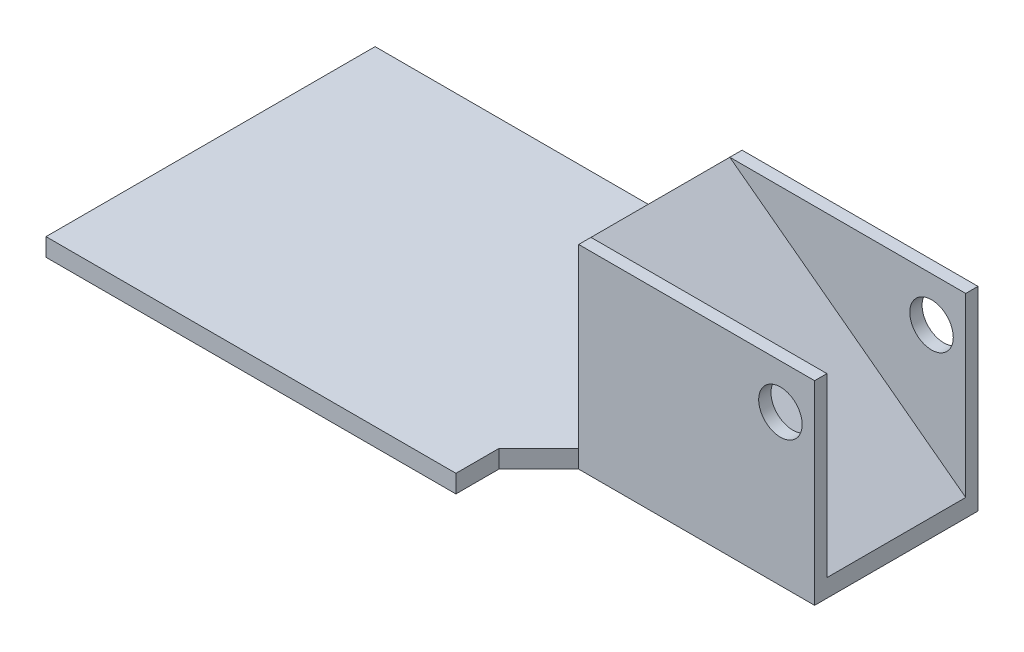
ISO-10303-21;
HEADER;
FILE_DESCRIPTION(('STEP AP214'),'2;1');
FILE_NAME('part.step','',(''),(''),'','','');
FILE_SCHEMA(('AUTOMOTIVE_DESIGN { 1 0 10303 214 1 1 1 1 }'));
ENDSEC;
DATA;
#1=APPLICATION_CONTEXT('core data for automotive mechanical design processes');
#2=APPLICATION_PROTOCOL_DEFINITION('international standard','automotive_design',2000,#1);
#3=PRODUCT_CONTEXT('',#1,'mechanical');
#4=PRODUCT('Part','Part','',(#3));
#5=PRODUCT_RELATED_PRODUCT_CATEGORY('part','',(#4));
#6=PRODUCT_DEFINITION_FORMATION('','',#4);
#7=PRODUCT_DEFINITION_CONTEXT('part definition',#1,'design');
#8=PRODUCT_DEFINITION('design','',#6,#7);
#9=PRODUCT_DEFINITION_SHAPE('','',#8);
#10=(LENGTH_UNIT() NAMED_UNIT(*) SI_UNIT(.MILLI.,.METRE.));
#11=(NAMED_UNIT(*) PLANE_ANGLE_UNIT() SI_UNIT($,.RADIAN.));
#12=(NAMED_UNIT(*) SI_UNIT($,.STERADIAN.) SOLID_ANGLE_UNIT());
#13=UNCERTAINTY_MEASURE_WITH_UNIT(LENGTH_MEASURE(1.E-05),#10,'distance_accuracy_value','');
#14=(GEOMETRIC_REPRESENTATION_CONTEXT(3) GLOBAL_UNCERTAINTY_ASSIGNED_CONTEXT((#13)) GLOBAL_UNIT_ASSIGNED_CONTEXT((#10,
#11,#12)) REPRESENTATION_CONTEXT('',''));
#15=CARTESIAN_POINT('',(0.,0.,0.));
#16=DIRECTION('',(0.,0.,1.));
#17=DIRECTION('',(1.,0.,0.));
#18=AXIS2_PLACEMENT_3D('',#15,#16,#17);
#19=CARTESIAN_POINT('',(0.,2.05994,0.));
#20=DIRECTION('',(0.,1.,0.));
#21=DIRECTION('',(0.,0.,1.));
#22=AXIS2_PLACEMENT_3D('',#19,#20,#21);
#23=PLANE('',#22);
#24=DIRECTION('',(-1.,0.,0.));
#25=VECTOR('',#24,1.);
#26=CARTESIAN_POINT('',(6.75557992798762,2.05994,29.8060041441728));
#27=LINE('',#26,#25);
#28=CARTESIAN_POINT('',(30.5689196087146,2.05994,29.8060041441728));
#29=VERTEX_POINT('',#28);
#30=CARTESIAN_POINT('',(6.75557992798762,2.05994,29.8060041441728));
#31=VERTEX_POINT('',#30);
#32=EDGE_CURVE('E216',#29,#31,#27,.T.);
#33=ORIENTED_EDGE('',*,*,#32,.F.);
#34=DIRECTION('',(0.,0.,-1.));
#35=VECTOR('',#34,1.);
#36=CARTESIAN_POINT('',(30.5689196087146,2.05994,29.8717192340563));
#37=LINE('',#36,#35);
#38=CARTESIAN_POINT('',(30.5689196087146,2.05994,13.8417792340563));
#39=VERTEX_POINT('',#38);
#40=EDGE_CURVE('E64',#29,#39,#37,.T.);
#41=ORIENTED_EDGE('',*,*,#40,.T.);
#42=DIRECTION('',(1.,0.,0.));
#43=VECTOR('',#42,1.);
#44=CARTESIAN_POINT('',(33.8878599279876,2.05994,13.8417792340563));
#45=LINE('',#44,#43);
#46=CARTESIAN_POINT('',(6.75557992798762,2.05994,13.8417792340563));
#47=VERTEX_POINT('',#46);
#48=EDGE_CURVE('E247',#47,#39,#45,.T.);
#49=ORIENTED_EDGE('',*,*,#48,.F.);
#50=DIRECTION('',(0.,0.,1.));
#51=VECTOR('',#50,1.);
#52=CARTESIAN_POINT('',(6.75557992798762,2.05994,13.8417792340563));
#53=LINE('',#52,#51);
#54=CARTESIAN_POINT('',(6.75557992798762,2.05994,12.4295392340563));
#55=VERTEX_POINT('',#54);
#56=EDGE_CURVE('E172',#55,#47,#53,.T.);
#57=ORIENTED_EDGE('',*,*,#56,.F.);
#58=DIRECTION('',(-0.707106781186546,0.,-0.707106781186549));
#59=VECTOR('',#58,1.);
#60=CARTESIAN_POINT('',(2.16579992798763,2.05994,7.83975923405626));
#61=LINE('',#60,#59);
#62=CARTESIAN_POINT('',(2.16579992798763,2.05994,7.83975923405626));
#63=VERTEX_POINT('',#62);
#64=EDGE_CURVE('E185',#55,#63,#61,.T.);
#65=ORIENTED_EDGE('',*,*,#64,.T.);
#66=DIRECTION('',(0.,0.,-1.));
#67=VECTOR('',#66,1.);
#68=CARTESIAN_POINT('',(2.16579992798763,2.05994,7.83975923405626));
#69=LINE('',#68,#67);
#70=CARTESIAN_POINT('',(2.16579992798763,2.05994,2.90089168911453));
#71=VERTEX_POINT('',#70);
#72=EDGE_CURVE('E289',#63,#71,#69,.T.);
#73=ORIENTED_EDGE('',*,*,#72,.T.);
#74=DIRECTION('',(-1.,0.,0.));
#75=VECTOR('',#74,1.);
#76=CARTESIAN_POINT('',(2.16579992798763,2.05994,2.90089168911453));
#77=LINE('',#76,#75);
#78=CARTESIAN_POINT('',(-44.9740600720124,2.05994,2.90089168911454));
#79=VERTEX_POINT('',#78);
#80=EDGE_CURVE('E271',#71,#79,#77,.T.);
#81=ORIENTED_EDGE('',*,*,#80,.T.);
#82=DIRECTION('',(0.,0.,1.));
#83=VECTOR('',#82,1.);
#84=CARTESIAN_POINT('',(-44.9740600720124,2.05994,2.90089168911454));
#85=LINE('',#84,#83);
#86=CARTESIAN_POINT('',(-44.9740600720124,2.05994,40.7468916891145));
#87=VERTEX_POINT('',#86);
#88=EDGE_CURVE('E275',#79,#87,#85,.T.);
#89=ORIENTED_EDGE('',*,*,#88,.T.);
#90=DIRECTION('',(1.,0.,0.));
#91=VECTOR('',#90,1.);
#92=CARTESIAN_POINT('',(-44.9740600720124,2.05994,40.7468916891145));
#93=LINE('',#92,#91);
#94=CARTESIAN_POINT('',(2.16579992798763,2.05994,40.7468916891145));
#95=VERTEX_POINT('',#94);
#96=EDGE_CURVE('E279',#87,#95,#93,.T.);
#97=ORIENTED_EDGE('',*,*,#96,.T.);
#98=DIRECTION('',(0.,0.,-1.));
#99=VECTOR('',#98,1.);
#100=CARTESIAN_POINT('',(2.16579992798763,2.05994,40.7468916891145));
#101=LINE('',#100,#99);
#102=CARTESIAN_POINT('',(2.16579992798763,2.05994,35.8080241441727));
#103=VERTEX_POINT('',#102);
#104=EDGE_CURVE('E282',#95,#103,#101,.T.);
#105=ORIENTED_EDGE('',*,*,#104,.T.);
#106=DIRECTION('',(0.707106781186552,0.,-0.707106781186543));
#107=VECTOR('',#106,1.);
#108=CARTESIAN_POINT('',(6.75557992798762,2.05994,31.2182441441728));
#109=LINE('',#108,#107);
#110=CARTESIAN_POINT('',(6.75557992798762,2.05994,31.2182441441728));
#111=VERTEX_POINT('',#110);
#112=EDGE_CURVE('E186',#103,#111,#109,.T.);
#113=ORIENTED_EDGE('',*,*,#112,.T.);
#114=DIRECTION('',(0.,0.,1.));
#115=VECTOR('',#114,1.);
#116=CARTESIAN_POINT('',(6.75557992798762,2.05994,31.2182441441728));
#117=LINE('',#116,#115);
#118=EDGE_CURVE('E220',#31,#111,#117,.T.);
#119=ORIENTED_EDGE('',*,*,#118,.F.);
#120=EDGE_LOOP('',(#33,#41,#49,#57,#65,#73,#81,#89,#97,#105,#113,#119));
#121=FACE_BOUND('',#120,.T.);
#122=ADVANCED_FACE('F39',(#121),#23,.T.);
#123=CARTESIAN_POINT('',(33.8878599279876,22.37994,13.8417792340563));
#124=DIRECTION('',(0.,0.,-1.));
#125=DIRECTION('',(-1.,0.,0.));
#126=AXIS2_PLACEMENT_3D('',#123,#124,#125);
#127=PLANE('',#126);
#128=DIRECTION('',(0.801501870641229,-0.59799226697225,0.));
#129=VECTOR('',#128,1.);
#130=CARTESIAN_POINT('',(6.75557992798762,19.8268267677945,13.8417792340563));
#131=LINE('',#130,#129);
#132=CARTESIAN_POINT('',(6.75557992798763,19.8268267677945,13.8417792340563));
#133=VERTEX_POINT('',#132);
#134=EDGE_CURVE('E56',#133,#39,#131,.T.);
#135=ORIENTED_EDGE('',*,*,#134,.F.);
#136=DIRECTION('',(0.,-1.,0.));
#137=VECTOR('',#136,1.);
#138=CARTESIAN_POINT('',(6.75557992798762,22.37994,13.8417792340563));
#139=LINE('',#138,#137);
#140=EDGE_CURVE('E263',#133,#47,#139,.T.);
#141=ORIENTED_EDGE('',*,*,#140,.T.);
#142=ORIENTED_EDGE('',*,*,#48,.T.);
#143=EDGE_LOOP('',(#135,#141,#142));
#144=FACE_BOUND('',#143,.T.);
#145=ADVANCED_FACE('F438',(#144),#127,.F.);
#146=CARTESIAN_POINT('',(29.9559399279876,17.2847,13.8417792340563));
#147=DIRECTION('',(0.,0.,-1.));
#148=DIRECTION('',(-1.,0.,0.));
#149=AXIS2_PLACEMENT_3D('',#146,#147,#148);
#150=CIRCLE('',#149,2.50063);
#151=CARTESIAN_POINT('',(27.4553099279876,17.2847,13.8417792340563));
#152=VERTEX_POINT('',#151);
#153=EDGE_CURVE('E208',#152,#152,#150,.T.);
#154=ORIENTED_EDGE('',*,*,#153,.T.);
#155=EDGE_LOOP('',(#154));
#156=FACE_BOUND('',#155,.T.);
#157=DIRECTION('',(-0.800413429281801,0.599448364936754,0.));
#158=VECTOR('',#157,1.);
#159=CARTESIAN_POINT('',(6.75557992798762,22.37994,13.8417792340563));
#160=LINE('',#159,#158);
#161=CARTESIAN_POINT('',(33.8878599279876,2.05994,13.8417792340563));
#162=VERTEX_POINT('',#161);
#163=CARTESIAN_POINT('',(6.75557992798762,22.37994,13.8417792340563));
#164=VERTEX_POINT('',#163);
#165=EDGE_CURVE('E415',#162,#164,#160,.T.);
#166=ORIENTED_EDGE('',*,*,#165,.F.);
#167=DIRECTION('',(0.,-1.,0.));
#168=VECTOR('',#167,1.);
#169=CARTESIAN_POINT('',(33.8878599279876,22.37994,13.8417792340563));
#170=LINE('',#169,#168);
#171=CARTESIAN_POINT('',(33.8878599279876,22.37994,13.8417792340563));
#172=VERTEX_POINT('',#171);
#173=EDGE_CURVE('E181',#172,#162,#170,.T.);
#174=ORIENTED_EDGE('',*,*,#173,.F.);
#175=DIRECTION('',(1.,0.,0.));
#176=VECTOR('',#175,1.);
#177=CARTESIAN_POINT('',(33.8878599279876,22.37994,13.8417792340563));
#178=LINE('',#177,#176);
#179=EDGE_CURVE('E253',#164,#172,#178,.T.);
#180=ORIENTED_EDGE('',*,*,#179,.F.);
#181=EDGE_LOOP('',(#166,#174,#180));
#182=FACE_BOUND('',#181,.T.);
#183=ADVANCED_FACE('F423',(#156,#182),#127,.F.);
#184=CARTESIAN_POINT('',(6.75557992798762,22.37994,29.8060041441728));
#185=DIRECTION('',(0.,0.,1.));
#186=DIRECTION('',(1.,0.,0.));
#187=AXIS2_PLACEMENT_3D('',#184,#185,#186);
#188=PLANE('',#187);
#189=DIRECTION('',(-0.801501870641229,0.59799226697225,0.));
#190=VECTOR('',#189,1.);
#191=CARTESIAN_POINT('',(5.53189338339606,20.7398066592554,29.8060041441728));
#192=LINE('',#191,#190);
#193=CARTESIAN_POINT('',(6.75557992798762,19.8268267677945,29.8060041441728));
#194=VERTEX_POINT('',#193);
#195=EDGE_CURVE('E193',#29,#194,#192,.T.);
#196=ORIENTED_EDGE('',*,*,#195,.F.);
#197=ORIENTED_EDGE('',*,*,#32,.T.);
#198=DIRECTION('',(0.,-1.,0.));
#199=VECTOR('',#198,1.);
#200=CARTESIAN_POINT('',(6.75557992798762,22.37994,29.8060041441728));
#201=LINE('',#200,#199);
#202=EDGE_CURVE('E173',#194,#31,#201,.T.);
#203=ORIENTED_EDGE('',*,*,#202,.F.);
#204=EDGE_LOOP('',(#196,#197,#203));
#205=FACE_BOUND('',#204,.T.);
#206=ADVANCED_FACE('F410',(#205),#188,.F.);
#207=CARTESIAN_POINT('',(29.9559399279876,17.2847,29.8060041441728));
#208=DIRECTION('',(0.,0.,1.));
#209=DIRECTION('',(1.,0.,0.));
#210=AXIS2_PLACEMENT_3D('',#207,#208,#209);
#211=CIRCLE('',#210,2.50063);
#212=CARTESIAN_POINT('',(32.4565699279876,17.2847,29.8060041441728));
#213=VERTEX_POINT('',#212);
#214=EDGE_CURVE('E43',#213,#213,#211,.T.);
#215=ORIENTED_EDGE('',*,*,#214,.T.);
#216=EDGE_LOOP('',(#215));
#217=FACE_BOUND('',#216,.T.);
#218=DIRECTION('',(0.800413429281801,-0.599448364936754,0.));
#219=VECTOR('',#218,1.);
#220=CARTESIAN_POINT('',(6.75557992798762,22.37994,29.8060041441728));
#221=LINE('',#220,#219);
#222=CARTESIAN_POINT('',(6.75557992798762,22.37994,29.8060041441728));
#223=VERTEX_POINT('',#222);
#224=CARTESIAN_POINT('',(33.8878599279876,2.05994,29.8060041441728));
#225=VERTEX_POINT('',#224);
#226=EDGE_CURVE('E165',#223,#225,#221,.T.);
#227=ORIENTED_EDGE('',*,*,#226,.F.);
#228=DIRECTION('',(-1.,0.,0.));
#229=VECTOR('',#228,1.);
#230=CARTESIAN_POINT('',(6.75557992798762,22.37994,29.8060041441728));
#231=LINE('',#230,#229);
#232=CARTESIAN_POINT('',(33.8878599279876,22.37994,29.8060041441728));
#233=VERTEX_POINT('',#232);
#234=EDGE_CURVE('E167',#233,#223,#231,.T.);
#235=ORIENTED_EDGE('',*,*,#234,.F.);
#236=DIRECTION('',(0.,-1.,0.));
#237=VECTOR('',#236,1.);
#238=CARTESIAN_POINT('',(33.8878599279876,22.37994,29.8060041441728));
#239=LINE('',#238,#237);
#240=EDGE_CURVE('E161',#233,#225,#239,.T.);
#241=ORIENTED_EDGE('',*,*,#240,.T.);
#242=EDGE_LOOP('',(#227,#235,#241));
#243=FACE_BOUND('',#242,.T.);
#244=ADVANCED_FACE('F163',(#217,#243),#188,.F.);
#245=CARTESIAN_POINT('',(2.16579992798763,2.05994,2.90089168911453));
#246=DIRECTION('',(0.,0.,1.));
#247=DIRECTION('',(1.,0.,0.));
#248=AXIS2_PLACEMENT_3D('',#245,#246,#247);
#249=PLANE('',#248);
#250=DIRECTION('',(-1.,0.,0.));
#251=VECTOR('',#250,1.);
#252=CARTESIAN_POINT('',(2.16579992798763,0.,2.90089168911453));
#253=LINE('',#252,#251);
#254=CARTESIAN_POINT('',(2.16579992798763,0.,2.90089168911453));
#255=VERTEX_POINT('',#254);
#256=CARTESIAN_POINT('',(-44.9740600720124,0.,2.90089168911454));
#257=VERTEX_POINT('',#256);
#258=EDGE_CURVE('E270',#255,#257,#253,.T.);
#259=ORIENTED_EDGE('',*,*,#258,.T.);
#260=DIRECTION('',(0.,-1.,0.));
#261=VECTOR('',#260,1.);
#262=CARTESIAN_POINT('',(-44.9740600720124,2.05994,2.90089168911454));
#263=LINE('',#262,#261);
#264=EDGE_CURVE('E11',#79,#257,#263,.T.);
#265=ORIENTED_EDGE('',*,*,#264,.F.);
#266=ORIENTED_EDGE('',*,*,#80,.F.);
#267=DIRECTION('',(0.,-1.,0.));
#268=VECTOR('',#267,1.);
#269=CARTESIAN_POINT('',(2.16579992798763,2.05994,2.90089168911453));
#270=LINE('',#269,#268);
#271=EDGE_CURVE('E292',#71,#255,#270,.T.);
#272=ORIENTED_EDGE('',*,*,#271,.T.);
#273=EDGE_LOOP('',(#259,#265,#266,#272));
#274=FACE_BOUND('',#273,.T.);
#275=ADVANCED_FACE('F41',(#274),#249,.F.);
#276=CARTESIAN_POINT('',(-44.9740600720124,2.05994,2.90089168911454));
#277=DIRECTION('',(1.,0.,0.));
#278=DIRECTION('',(0.,0.,-1.));
#279=AXIS2_PLACEMENT_3D('',#276,#277,#278);
#280=PLANE('',#279);
#281=DIRECTION('',(0.,0.,1.));
#282=VECTOR('',#281,1.);
#283=CARTESIAN_POINT('',(-44.9740600720124,0.,2.90089168911454));
#284=LINE('',#283,#282);
#285=CARTESIAN_POINT('',(-44.9740600720124,0.,40.7468916891145));
#286=VERTEX_POINT('',#285);
#287=EDGE_CURVE('E296',#257,#286,#284,.T.);
#288=ORIENTED_EDGE('',*,*,#287,.T.);
#289=DIRECTION('',(0.,-1.,0.));
#290=VECTOR('',#289,1.);
#291=CARTESIAN_POINT('',(-44.9740600720124,2.05994,40.7468916891145));
#292=LINE('',#291,#290);
#293=EDGE_CURVE('E49',#87,#286,#292,.T.);
#294=ORIENTED_EDGE('',*,*,#293,.F.);
#295=ORIENTED_EDGE('',*,*,#88,.F.);
#296=ORIENTED_EDGE('',*,*,#264,.T.);
#297=EDGE_LOOP('',(#288,#294,#295,#296));
#298=FACE_BOUND('',#297,.T.);
#299=ADVANCED_FACE('F379',(#298),#280,.F.);
#300=CARTESIAN_POINT('',(-44.9740600720124,2.05994,40.7468916891145));
#301=DIRECTION('',(0.,0.,-1.));
#302=DIRECTION('',(-1.,0.,0.));
#303=AXIS2_PLACEMENT_3D('',#300,#301,#302);
#304=PLANE('',#303);
#305=DIRECTION('',(1.,0.,0.));
#306=VECTOR('',#305,1.);
#307=CARTESIAN_POINT('',(-44.9740600720124,0.,40.7468916891145));
#308=LINE('',#307,#306);
#309=CARTESIAN_POINT('',(2.16579992798763,0.,40.7468916891145));
#310=VERTEX_POINT('',#309);
#311=EDGE_CURVE('E299',#286,#310,#308,.T.);
#312=ORIENTED_EDGE('',*,*,#311,.T.);
#313=DIRECTION('',(0.,-1.,0.));
#314=VECTOR('',#313,1.);
#315=CARTESIAN_POINT('',(2.16579992798763,2.05994,40.7468916891145));
#316=LINE('',#315,#314);
#317=EDGE_CURVE('E349',#95,#310,#316,.T.);
#318=ORIENTED_EDGE('',*,*,#317,.F.);
#319=ORIENTED_EDGE('',*,*,#96,.F.);
#320=ORIENTED_EDGE('',*,*,#293,.T.);
#321=EDGE_LOOP('',(#312,#318,#319,#320));
#322=FACE_BOUND('',#321,.T.);
#323=ADVANCED_FACE('F359',(#322),#304,.F.);
#324=CARTESIAN_POINT('',(2.16579992798763,2.05994,40.7468916891145));
#325=DIRECTION('',(-1.,0.,0.));
#326=DIRECTION('',(0.,0.,1.));
#327=AXIS2_PLACEMENT_3D('',#324,#325,#326);
#328=PLANE('',#327);
#329=DIRECTION('',(0.,0.,-1.));
#330=VECTOR('',#329,1.);
#331=CARTESIAN_POINT('',(2.16579992798763,0.,40.7468916891145));
#332=LINE('',#331,#330);
#333=CARTESIAN_POINT('',(2.16579992798763,0.,35.8080241441727));
#334=VERTEX_POINT('',#333);
#335=EDGE_CURVE('E302',#310,#334,#332,.T.);
#336=ORIENTED_EDGE('',*,*,#335,.T.);
#337=DIRECTION('',(0.,-1.,0.));
#338=VECTOR('',#337,1.);
#339=CARTESIAN_POINT('',(2.16579992798763,2.05994,35.8080241441727));
#340=LINE('',#339,#338);
#341=EDGE_CURVE('E345',#103,#334,#340,.T.);
#342=ORIENTED_EDGE('',*,*,#341,.F.);
#343=ORIENTED_EDGE('',*,*,#104,.F.);
#344=ORIENTED_EDGE('',*,*,#317,.T.);
#345=EDGE_LOOP('',(#336,#342,#343,#344));
#346=FACE_BOUND('',#345,.T.);
#347=ADVANCED_FACE('F370',(#346),#328,.F.);
#348=CARTESIAN_POINT('',(6.75557992798762,2.05994,31.2182441441728));
#349=DIRECTION('',(-0.707106781186543,0.,-0.707106781186552));
#350=DIRECTION('',(-0.707106781186552,0.,0.707106781186543));
#351=AXIS2_PLACEMENT_3D('',#348,#349,#350);
#352=PLANE('',#351);
#353=DIRECTION('',(0.707106781186552,0.,-0.707106781186543));
#354=VECTOR('',#353,1.);
#355=CARTESIAN_POINT('',(6.75557992798762,0.,31.2182441441728));
#356=LINE('',#355,#354);
#357=CARTESIAN_POINT('',(6.75557992798762,0.,31.2182441441728));
#358=VERTEX_POINT('',#357);
#359=EDGE_CURVE('E305',#334,#358,#356,.T.);
#360=ORIENTED_EDGE('',*,*,#359,.T.);
#361=DIRECTION('',(0.,-1.,0.));
#362=VECTOR('',#361,1.);
#363=CARTESIAN_POINT('',(6.75557992798762,2.05994,31.2182441441728));
#364=LINE('',#363,#362);
#365=EDGE_CURVE('E341',#111,#358,#364,.T.);
#366=ORIENTED_EDGE('',*,*,#365,.F.);
#367=ORIENTED_EDGE('',*,*,#112,.F.);
#368=ORIENTED_EDGE('',*,*,#341,.T.);
#369=EDGE_LOOP('',(#360,#366,#367,#368));
#370=FACE_BOUND('',#369,.T.);
#371=ADVANCED_FACE('F374',(#370),#352,.F.);
#372=CARTESIAN_POINT('',(33.8878599279876,2.05994,31.2182441441728));
#373=DIRECTION('',(0.,0.,-1.));
#374=DIRECTION('',(-1.,0.,0.));
#375=AXIS2_PLACEMENT_3D('',#372,#373,#374);
#376=PLANE('',#375);
#377=CARTESIAN_POINT('',(29.9559399279876,17.2847,31.2182441441728));
#378=DIRECTION('',(0.,0.,1.));
#379=DIRECTION('',(1.,0.,0.));
#380=AXIS2_PLACEMENT_3D('',#377,#378,#379);
#381=CIRCLE('',#380,2.50063);
#382=CARTESIAN_POINT('',(32.4565699279876,17.2847,31.2182441441728));
#383=VERTEX_POINT('',#382);
#384=EDGE_CURVE('E199',#383,#383,#381,.T.);
#385=ORIENTED_EDGE('',*,*,#384,.F.);
#386=EDGE_LOOP('',(#385));
#387=FACE_BOUND('',#386,.T.);
#388=DIRECTION('',(1.,0.,0.));
#389=VECTOR('',#388,1.);
#390=CARTESIAN_POINT('',(33.8878599279876,0.,31.2182441441728));
#391=LINE('',#390,#389);
#392=CARTESIAN_POINT('',(33.8878599279876,0.,31.2182441441728));
#393=VERTEX_POINT('',#392);
#394=EDGE_CURVE('E308',#358,#393,#391,.T.);
#395=ORIENTED_EDGE('',*,*,#394,.T.);
#396=DIRECTION('',(0.,-1.,0.));
#397=VECTOR('',#396,1.);
#398=CARTESIAN_POINT('',(33.8878599279876,2.05994,31.2182441441728));
#399=LINE('',#398,#397);
#400=CARTESIAN_POINT('',(33.8878599279876,22.37994,31.2182441441728));
#401=VERTEX_POINT('',#400);
#402=EDGE_CURVE('E337',#401,#393,#399,.T.);
#403=ORIENTED_EDGE('',*,*,#402,.F.);
#404=DIRECTION('',(1.,0.,0.));
#405=VECTOR('',#404,1.);
#406=CARTESIAN_POINT('',(33.8878599279876,22.37994,31.2182441441728));
#407=LINE('',#406,#405);
#408=CARTESIAN_POINT('',(6.75557992798762,22.37994,31.2182441441728));
#409=VERTEX_POINT('',#408);
#410=EDGE_CURVE('E226',#409,#401,#407,.T.);
#411=ORIENTED_EDGE('',*,*,#410,.F.);
#412=DIRECTION('',(0.,-1.,0.));
#413=VECTOR('',#412,1.);
#414=CARTESIAN_POINT('',(6.75557992798762,22.37994,31.2182441441728));
#415=LINE('',#414,#413);
#416=EDGE_CURVE('E230',#409,#111,#415,.T.);
#417=ORIENTED_EDGE('',*,*,#416,.T.);
#418=ORIENTED_EDGE('',*,*,#365,.T.);
#419=EDGE_LOOP('',(#395,#403,#411,#417,#418));
#420=FACE_BOUND('',#419,.T.);
#421=ADVANCED_FACE('F401',(#387,#420),#376,.F.);
#422=CARTESIAN_POINT('',(33.8878599279876,2.05994,12.4295392340563));
#423=DIRECTION('',(-1.,0.,0.));
#424=DIRECTION('',(0.,0.,1.));
#425=AXIS2_PLACEMENT_3D('',#422,#423,#424);
#426=PLANE('',#425);
#427=DIRECTION('',(0.,0.,-1.));
#428=VECTOR('',#427,1.);
#429=CARTESIAN_POINT('',(33.8878599279876,0.,12.4295392340563));
#430=LINE('',#429,#428);
#431=CARTESIAN_POINT('',(33.8878599279876,0.,12.4295392340563));
#432=VERTEX_POINT('',#431);
#433=EDGE_CURVE('E311',#393,#432,#430,.T.);
#434=ORIENTED_EDGE('',*,*,#433,.T.);
#435=DIRECTION('',(0.,-1.,0.));
#436=VECTOR('',#435,1.);
#437=CARTESIAN_POINT('',(33.8878599279876,2.05994,12.4295392340563));
#438=LINE('',#437,#436);
#439=CARTESIAN_POINT('',(33.8878599279876,22.37994,12.4295392340563));
#440=VERTEX_POINT('',#439);
#441=EDGE_CURVE('E333',#440,#432,#438,.T.);
#442=ORIENTED_EDGE('',*,*,#441,.F.);
#443=DIRECTION('',(0.,0.,-1.));
#444=VECTOR('',#443,1.);
#445=CARTESIAN_POINT('',(33.8878599279876,22.37994,12.4295392340563));
#446=LINE('',#445,#444);
#447=EDGE_CURVE('E242',#172,#440,#446,.T.);
#448=ORIENTED_EDGE('',*,*,#447,.F.);
#449=ORIENTED_EDGE('',*,*,#173,.T.);
#450=DIRECTION('',(0.,0.,-1.));
#451=VECTOR('',#450,1.);
#452=CARTESIAN_POINT('',(33.8878599279876,2.05994,12.4295392340563));
#453=LINE('',#452,#451);
#454=EDGE_CURVE('E177',#225,#162,#453,.T.);
#455=ORIENTED_EDGE('',*,*,#454,.F.);
#456=ORIENTED_EDGE('',*,*,#240,.F.);
#457=DIRECTION('',(0.,0.,-1.));
#458=VECTOR('',#457,1.);
#459=CARTESIAN_POINT('',(33.8878599279876,22.37994,29.8060041441728));
#460=LINE('',#459,#458);
#461=EDGE_CURVE('E217',#401,#233,#460,.T.);
#462=ORIENTED_EDGE('',*,*,#461,.F.);
#463=ORIENTED_EDGE('',*,*,#402,.T.);
#464=EDGE_LOOP('',(#434,#442,#448,#449,#455,#456,#462,#463));
#465=FACE_BOUND('',#464,.T.);
#466=ADVANCED_FACE('F178',(#465),#426,.F.);
#467=CARTESIAN_POINT('',(6.75557992798762,2.05994,12.4295392340563));
#468=DIRECTION('',(0.,0.,1.));
#469=DIRECTION('',(1.,0.,0.));
#470=AXIS2_PLACEMENT_3D('',#467,#468,#469);
#471=PLANE('',#470);
#472=CARTESIAN_POINT('',(29.9559399279876,17.2847,12.4295392340563));
#473=DIRECTION('',(0.,0.,1.));
#474=DIRECTION('',(1.,0.,0.));
#475=AXIS2_PLACEMENT_3D('',#472,#473,#474);
#476=CIRCLE('',#475,2.50063);
#477=CARTESIAN_POINT('',(32.4565699279876,17.2847,12.4295392340563));
#478=VERTEX_POINT('',#477);
#479=EDGE_CURVE('E212',#478,#478,#476,.T.);
#480=ORIENTED_EDGE('',*,*,#479,.T.);
#481=EDGE_LOOP('',(#480));
#482=FACE_BOUND('',#481,.T.);
#483=DIRECTION('',(-1.,0.,0.));
#484=VECTOR('',#483,1.);
#485=CARTESIAN_POINT('',(6.75557992798762,0.,12.4295392340563));
#486=LINE('',#485,#484);
#487=CARTESIAN_POINT('',(6.75557992798762,0.,12.4295392340563));
#488=VERTEX_POINT('',#487);
#489=EDGE_CURVE('E314',#432,#488,#486,.T.);
#490=ORIENTED_EDGE('',*,*,#489,.T.);
#491=DIRECTION('',(0.,-1.,0.));
#492=VECTOR('',#491,1.);
#493=CARTESIAN_POINT('',(6.75557992798762,2.05994,12.4295392340563));
#494=LINE('',#493,#492);
#495=EDGE_CURVE('E329',#55,#488,#494,.T.);
#496=ORIENTED_EDGE('',*,*,#495,.F.);
#497=DIRECTION('',(0.,-1.,0.));
#498=VECTOR('',#497,1.);
#499=CARTESIAN_POINT('',(6.75557992798762,22.37994,12.4295392340563));
#500=LINE('',#499,#498);
#501=CARTESIAN_POINT('',(6.75557992798762,22.37994,12.4295392340563));
#502=VERTEX_POINT('',#501);
#503=EDGE_CURVE('E266',#502,#55,#500,.T.);
#504=ORIENTED_EDGE('',*,*,#503,.F.);
#505=DIRECTION('',(-1.,0.,0.));
#506=VECTOR('',#505,1.);
#507=CARTESIAN_POINT('',(6.75557992798762,22.37994,12.4295392340563));
#508=LINE('',#507,#506);
#509=EDGE_CURVE('E246',#440,#502,#508,.T.);
#510=ORIENTED_EDGE('',*,*,#509,.F.);
#511=ORIENTED_EDGE('',*,*,#441,.T.);
#512=EDGE_LOOP('',(#490,#496,#504,#510,#511));
#513=FACE_BOUND('',#512,.T.);
#514=ADVANCED_FACE('F395',(#482,#513),#471,.F.);
#515=CARTESIAN_POINT('',(2.16579992798763,2.05994,7.83975923405626));
#516=DIRECTION('',(-0.707106781186549,0.,0.707106781186546));
#517=DIRECTION('',(0.707106781186546,0.,0.707106781186549));
#518=AXIS2_PLACEMENT_3D('',#515,#516,#517);
#519=PLANE('',#518);
#520=DIRECTION('',(-0.707106781186546,0.,-0.707106781186549));
#521=VECTOR('',#520,1.);
#522=CARTESIAN_POINT('',(2.16579992798763,0.,7.83975923405626));
#523=LINE('',#522,#521);
#524=CARTESIAN_POINT('',(2.16579992798763,0.,7.83975923405626));
#525=VERTEX_POINT('',#524);
#526=EDGE_CURVE('E317',#488,#525,#523,.T.);
#527=ORIENTED_EDGE('',*,*,#526,.T.);
#528=DIRECTION('',(0.,-1.,0.));
#529=VECTOR('',#528,1.);
#530=CARTESIAN_POINT('',(2.16579992798763,2.05994,7.83975923405626));
#531=LINE('',#530,#529);
#532=EDGE_CURVE('E325',#63,#525,#531,.T.);
#533=ORIENTED_EDGE('',*,*,#532,.F.);
#534=ORIENTED_EDGE('',*,*,#64,.F.);
#535=ORIENTED_EDGE('',*,*,#495,.T.);
#536=EDGE_LOOP('',(#527,#533,#534,#535));
#537=FACE_BOUND('',#536,.T.);
#538=ADVANCED_FACE('F391',(#537),#519,.F.);
#539=CARTESIAN_POINT('',(2.16579992798763,2.05994,7.83975923405626));
#540=DIRECTION('',(-1.,0.,0.));
#541=DIRECTION('',(0.,0.,1.));
#542=AXIS2_PLACEMENT_3D('',#539,#540,#541);
#543=PLANE('',#542);
#544=DIRECTION('',(0.,0.,-1.));
#545=VECTOR('',#544,1.);
#546=CARTESIAN_POINT('',(2.16579992798763,0.,7.83975923405626));
#547=LINE('',#546,#545);
#548=EDGE_CURVE('E276',#525,#255,#547,.T.);
#549=ORIENTED_EDGE('',*,*,#548,.T.);
#550=ORIENTED_EDGE('',*,*,#271,.F.);
#551=ORIENTED_EDGE('',*,*,#72,.F.);
#552=ORIENTED_EDGE('',*,*,#532,.T.);
#553=EDGE_LOOP('',(#549,#550,#551,#552));
#554=FACE_BOUND('',#553,.T.);
#555=ADVANCED_FACE('F386',(#554),#543,.F.);
#556=CARTESIAN_POINT('',(0.,0.,0.));
#557=DIRECTION('',(0.,1.,0.));
#558=DIRECTION('',(0.,0.,1.));
#559=AXIS2_PLACEMENT_3D('',#556,#557,#558);
#560=PLANE('',#559);
#561=ORIENTED_EDGE('',*,*,#258,.F.);
#562=ORIENTED_EDGE('',*,*,#548,.F.);
#563=ORIENTED_EDGE('',*,*,#526,.F.);
#564=ORIENTED_EDGE('',*,*,#489,.F.);
#565=ORIENTED_EDGE('',*,*,#433,.F.);
#566=ORIENTED_EDGE('',*,*,#394,.F.);
#567=ORIENTED_EDGE('',*,*,#359,.F.);
#568=ORIENTED_EDGE('',*,*,#335,.F.);
#569=ORIENTED_EDGE('',*,*,#311,.F.);
#570=ORIENTED_EDGE('',*,*,#287,.F.);
#571=EDGE_LOOP('',(#561,#562,#563,#564,#565,#566,#567,#568,#569,#570));
#572=FACE_BOUND('',#571,.T.);
#573=ADVANCED_FACE('F365',(#572),#560,.F.);
#574=CARTESIAN_POINT('',(6.75557992798762,22.37994,13.8417792340563));
#575=DIRECTION('',(1.,0.,0.));
#576=DIRECTION('',(0.,0.,-1.));
#577=AXIS2_PLACEMENT_3D('',#574,#575,#576);
#578=PLANE('',#577);
#579=ORIENTED_EDGE('',*,*,#56,.T.);
#580=ORIENTED_EDGE('',*,*,#140,.F.);
#581=DIRECTION('',(0.,0.,-1.));
#582=VECTOR('',#581,1.);
#583=CARTESIAN_POINT('',(6.75557992798762,19.8268267677945,29.8717192340563));
#584=LINE('',#583,#582);
#585=EDGE_CURVE('E194',#194,#133,#584,.T.);
#586=ORIENTED_EDGE('',*,*,#585,.F.);
#587=ORIENTED_EDGE('',*,*,#202,.T.);
#588=ORIENTED_EDGE('',*,*,#118,.T.);
#589=ORIENTED_EDGE('',*,*,#416,.F.);
#590=DIRECTION('',(0.,0.,1.));
#591=VECTOR('',#590,1.);
#592=CARTESIAN_POINT('',(6.75557992798762,22.37994,31.2182441441728));
#593=LINE('',#592,#591);
#594=EDGE_CURVE('E223',#223,#409,#593,.T.);
#595=ORIENTED_EDGE('',*,*,#594,.F.);
#596=DIRECTION('',(0.,0.,-1.));
#597=VECTOR('',#596,1.);
#598=CARTESIAN_POINT('',(6.75557992798762,22.37994,29.8717192340563));
#599=LINE('',#598,#597);
#600=EDGE_CURVE('E191',#223,#164,#599,.T.);
#601=ORIENTED_EDGE('',*,*,#600,.T.);
#602=DIRECTION('',(0.,0.,1.));
#603=VECTOR('',#602,1.);
#604=CARTESIAN_POINT('',(6.75557992798762,22.37994,13.8417792340563));
#605=LINE('',#604,#603);
#606=EDGE_CURVE('E250',#502,#164,#605,.T.);
#607=ORIENTED_EDGE('',*,*,#606,.F.);
#608=ORIENTED_EDGE('',*,*,#503,.T.);
#609=EDGE_LOOP('',(#579,#580,#586,#587,#588,#589,#595,#601,#607,#608));
#610=FACE_BOUND('',#609,.T.);
#611=ADVANCED_FACE('F407',(#610),#578,.F.);
#612=CARTESIAN_POINT('',(0.,22.37994,0.));
#613=DIRECTION('',(0.,-1.,0.));
#614=DIRECTION('',(0.,0.,-1.));
#615=AXIS2_PLACEMENT_3D('',#612,#613,#614);
#616=PLANE('',#615);
#617=ORIENTED_EDGE('',*,*,#447,.T.);
#618=ORIENTED_EDGE('',*,*,#509,.T.);
#619=ORIENTED_EDGE('',*,*,#606,.T.);
#620=ORIENTED_EDGE('',*,*,#179,.T.);
#621=EDGE_LOOP('',(#617,#618,#619,#620));
#622=FACE_BOUND('',#621,.T.);
#623=ADVANCED_FACE('F425',(#622),#616,.F.);
#624=CARTESIAN_POINT('',(0.,22.37994,0.));
#625=DIRECTION('',(0.,-1.,0.));
#626=DIRECTION('',(0.,0.,-1.));
#627=AXIS2_PLACEMENT_3D('',#624,#625,#626);
#628=PLANE('',#627);
#629=ORIENTED_EDGE('',*,*,#461,.T.);
#630=ORIENTED_EDGE('',*,*,#234,.T.);
#631=ORIENTED_EDGE('',*,*,#594,.T.);
#632=ORIENTED_EDGE('',*,*,#410,.T.);
#633=EDGE_LOOP('',(#629,#630,#631,#632));
#634=FACE_BOUND('',#633,.T.);
#635=ADVANCED_FACE('F403',(#634),#628,.F.);
#636=CARTESIAN_POINT('',(29.9559399279876,17.2847,5.8182441441728));
#637=DIRECTION('',(0.,0.,1.));
#638=DIRECTION('',(1.,0.,0.));
#639=AXIS2_PLACEMENT_3D('',#636,#637,#638);
#640=CYLINDRICAL_SURFACE('',#639,2.50063);
#641=ORIENTED_EDGE('',*,*,#384,.T.);
#642=EDGE_LOOP('',(#641));
#643=FACE_BOUND('',#642,.T.);
#644=ORIENTED_EDGE('',*,*,#214,.F.);
#645=EDGE_LOOP('',(#644));
#646=FACE_BOUND('',#645,.T.);
#647=ADVANCED_FACE('F432',(#643,#646),#640,.F.);
#648=ORIENTED_EDGE('',*,*,#153,.F.);
#649=EDGE_LOOP('',(#648));
#650=FACE_BOUND('',#649,.T.);
#651=ORIENTED_EDGE('',*,*,#479,.F.);
#652=EDGE_LOOP('',(#651));
#653=FACE_BOUND('',#652,.T.);
#654=ADVANCED_FACE('F476',(#650,#653),#640,.F.);
#655=CARTESIAN_POINT('',(6.75557992798762,19.8268267677945,29.8717192340563));
#656=DIRECTION('',(0.59799226697225,0.801501870641229,0.));
#657=DIRECTION('',(-0.801501870641229,0.59799226697225,0.));
#658=AXIS2_PLACEMENT_3D('',#655,#656,#657);
#659=PLANE('',#658);
#660=ORIENTED_EDGE('',*,*,#40,.F.);
#661=ORIENTED_EDGE('',*,*,#195,.T.);
#662=ORIENTED_EDGE('',*,*,#585,.T.);
#663=ORIENTED_EDGE('',*,*,#134,.T.);
#664=EDGE_LOOP('',(#660,#661,#662,#663));
#665=FACE_BOUND('',#664,.T.);
#666=ADVANCED_FACE('F412',(#665),#659,.F.);
#667=CARTESIAN_POINT('',(6.75557992798762,22.37994,29.8717192340563));
#668=DIRECTION('',(-0.599448364936754,-0.800413429281801,0.));
#669=DIRECTION('',(0.800413429281801,-0.599448364936754,0.));
#670=AXIS2_PLACEMENT_3D('',#667,#668,#669);
#671=PLANE('',#670);
#672=ORIENTED_EDGE('',*,*,#600,.F.);
#673=ORIENTED_EDGE('',*,*,#226,.T.);
#674=ORIENTED_EDGE('',*,*,#454,.T.);
#675=ORIENTED_EDGE('',*,*,#165,.T.);
#676=EDGE_LOOP('',(#672,#673,#674,#675));
#677=FACE_BOUND('',#676,.T.);
#678=ADVANCED_FACE('F189',(#677),#671,.F.);
#679=CLOSED_SHELL('',(#122,#145,#183,#206,#244,#275,#299,#323,#347,#371,#421,#466,#514,#538,
#555,#573,#611,#623,#635,#647,#654,#666,#678));
#680=MANIFOLD_SOLID_BREP('B2',#679);
#681=ADVANCED_BREP_SHAPE_REPRESENTATION('',(#18,#680),#14);
#682=SHAPE_DEFINITION_REPRESENTATION(#9,#681);
ENDSEC;
END-ISO-10303-21;
